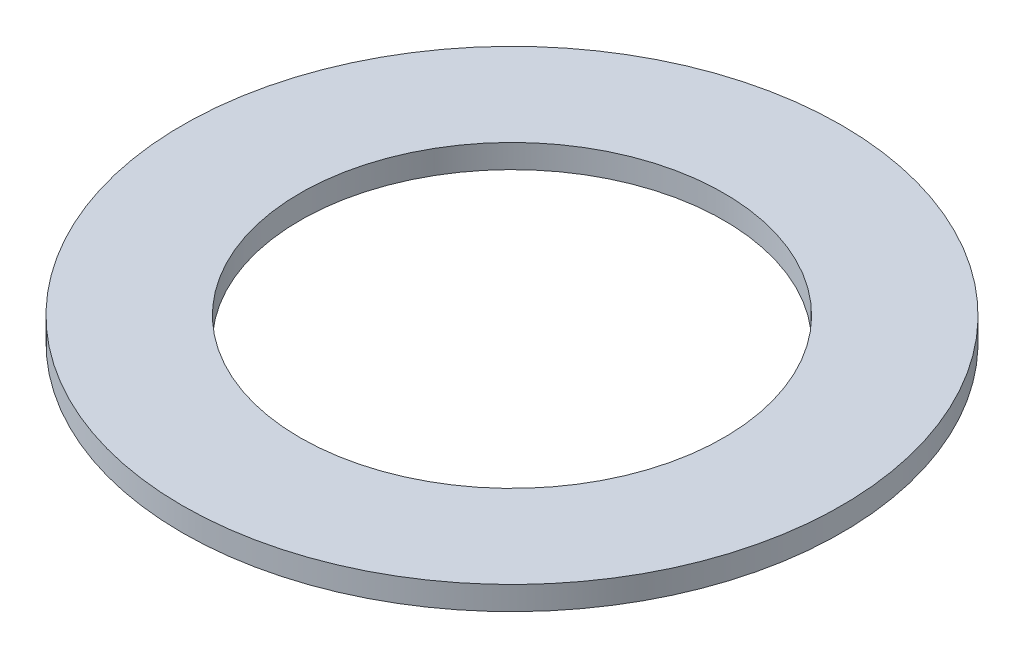
ISO-10303-21;
HEADER;
FILE_DESCRIPTION(('STEP AP214'),'2;1');
FILE_NAME('part.step','',(''),(''),'','','');
FILE_SCHEMA(('AUTOMOTIVE_DESIGN { 1 0 10303 214 1 1 1 1 }'));
ENDSEC;
DATA;
#1=APPLICATION_CONTEXT('core data for automotive mechanical design processes');
#2=APPLICATION_PROTOCOL_DEFINITION('international standard','automotive_design',2000,#1);
#3=PRODUCT_CONTEXT('',#1,'mechanical');
#4=PRODUCT('Part','Part','',(#3));
#5=PRODUCT_RELATED_PRODUCT_CATEGORY('part','',(#4));
#6=PRODUCT_DEFINITION_FORMATION('','',#4);
#7=PRODUCT_DEFINITION_CONTEXT('part definition',#1,'design');
#8=PRODUCT_DEFINITION('design','',#6,#7);
#9=PRODUCT_DEFINITION_SHAPE('','',#8);
#10=(LENGTH_UNIT() NAMED_UNIT(*) SI_UNIT(.MILLI.,.METRE.));
#11=(NAMED_UNIT(*) PLANE_ANGLE_UNIT() SI_UNIT($,.RADIAN.));
#12=(NAMED_UNIT(*) SI_UNIT($,.STERADIAN.) SOLID_ANGLE_UNIT());
#13=UNCERTAINTY_MEASURE_WITH_UNIT(LENGTH_MEASURE(1.E-05),#10,'distance_accuracy_value','');
#14=(GEOMETRIC_REPRESENTATION_CONTEXT(3) GLOBAL_UNCERTAINTY_ASSIGNED_CONTEXT((#13)) GLOBAL_UNIT_ASSIGNED_CONTEXT((#10,
#11,#12)) REPRESENTATION_CONTEXT('',''));
#15=CARTESIAN_POINT('',(0.,0.,0.));
#16=DIRECTION('',(0.,0.,1.));
#17=DIRECTION('',(1.,0.,0.));
#18=AXIS2_PLACEMENT_3D('',#15,#16,#17);
#19=CARTESIAN_POINT('',(0.,0.5,0.));
#20=DIRECTION('',(0.,1.,0.));
#21=DIRECTION('',(0.,0.,1.));
#22=AXIS2_PLACEMENT_3D('',#19,#20,#21);
#23=PLANE('',#22);
#24=CARTESIAN_POINT('',(0.,0.5,0.));
#25=DIRECTION('',(0.,1.,0.));
#26=DIRECTION('',(0.,0.,1.));
#27=AXIS2_PLACEMENT_3D('',#24,#25,#26);
#28=CIRCLE('',#27,7.);
#29=CARTESIAN_POINT('',(0.,0.5,7.));
#30=VERTEX_POINT('',#29);
#31=EDGE_CURVE('E10',#30,#30,#28,.T.);
#32=ORIENTED_EDGE('',*,*,#31,.T.);
#33=EDGE_LOOP('',(#32));
#34=FACE_BOUND('',#33,.T.);
#35=CARTESIAN_POINT('',(0.,0.5,0.));
#36=DIRECTION('',(0.,1.,0.));
#37=DIRECTION('',(0.,0.,1.));
#38=AXIS2_PLACEMENT_3D('',#35,#36,#37);
#39=CIRCLE('',#38,4.5);
#40=CARTESIAN_POINT('',(0.,0.5,4.5));
#41=VERTEX_POINT('',#40);
#42=EDGE_CURVE('E41',#41,#41,#39,.T.);
#43=ORIENTED_EDGE('',*,*,#42,.F.);
#44=EDGE_LOOP('',(#43));
#45=FACE_BOUND('',#44,.T.);
#46=ADVANCED_FACE('F30',(#34,#45),#23,.T.);
#47=CARTESIAN_POINT('',(0.,0.,0.));
#48=DIRECTION('',(0.,1.,0.));
#49=DIRECTION('',(0.,0.,1.));
#50=AXIS2_PLACEMENT_3D('',#47,#48,#49);
#51=PLANE('',#50);
#52=CARTESIAN_POINT('',(0.,0.,0.));
#53=DIRECTION('',(0.,1.,0.));
#54=DIRECTION('',(0.,0.,1.));
#55=AXIS2_PLACEMENT_3D('',#52,#53,#54);
#56=CIRCLE('',#55,7.);
#57=CARTESIAN_POINT('',(0.,0.,7.));
#58=VERTEX_POINT('',#57);
#59=EDGE_CURVE('E34',#58,#58,#56,.T.);
#60=ORIENTED_EDGE('',*,*,#59,.F.);
#61=EDGE_LOOP('',(#60));
#62=FACE_BOUND('',#61,.T.);
#63=CARTESIAN_POINT('',(0.,0.,0.));
#64=DIRECTION('',(0.,1.,0.));
#65=DIRECTION('',(0.,0.,1.));
#66=AXIS2_PLACEMENT_3D('',#63,#64,#65);
#67=CIRCLE('',#66,4.5);
#68=CARTESIAN_POINT('',(0.,0.,4.5));
#69=VERTEX_POINT('',#68);
#70=EDGE_CURVE('E43',#69,#69,#67,.T.);
#71=ORIENTED_EDGE('',*,*,#70,.T.);
#72=EDGE_LOOP('',(#71));
#73=FACE_BOUND('',#72,.T.);
#74=ADVANCED_FACE('F53',(#62,#73),#51,.F.);
#75=CARTESIAN_POINT('',(0.,0.5,0.));
#76=DIRECTION('',(0.,-1.,0.));
#77=DIRECTION('',(0.,0.,-1.));
#78=AXIS2_PLACEMENT_3D('',#75,#76,#77);
#79=CYLINDRICAL_SURFACE('',#78,7.);
#80=ORIENTED_EDGE('',*,*,#31,.F.);
#81=EDGE_LOOP('',(#80));
#82=FACE_BOUND('',#81,.T.);
#83=ORIENTED_EDGE('',*,*,#59,.T.);
#84=EDGE_LOOP('',(#83));
#85=FACE_BOUND('',#84,.T.);
#86=ADVANCED_FACE('F32',(#82,#85),#79,.T.);
#87=CARTESIAN_POINT('',(0.,0.5,0.));
#88=DIRECTION('',(0.,-1.,0.));
#89=DIRECTION('',(0.,0.,-1.));
#90=AXIS2_PLACEMENT_3D('',#87,#88,#89);
#91=CYLINDRICAL_SURFACE('',#90,4.5);
#92=ORIENTED_EDGE('',*,*,#42,.T.);
#93=EDGE_LOOP('',(#92));
#94=FACE_BOUND('',#93,.T.);
#95=ORIENTED_EDGE('',*,*,#70,.F.);
#96=EDGE_LOOP('',(#95));
#97=FACE_BOUND('',#96,.T.);
#98=ADVANCED_FACE('F49',(#94,#97),#91,.F.);
#99=CLOSED_SHELL('',(#46,#74,#86,#98));
#100=MANIFOLD_SOLID_BREP('B2',#99);
#101=ADVANCED_BREP_SHAPE_REPRESENTATION('',(#18,#100),#14);
#102=SHAPE_DEFINITION_REPRESENTATION(#9,#101);
ENDSEC;
END-ISO-10303-21;
